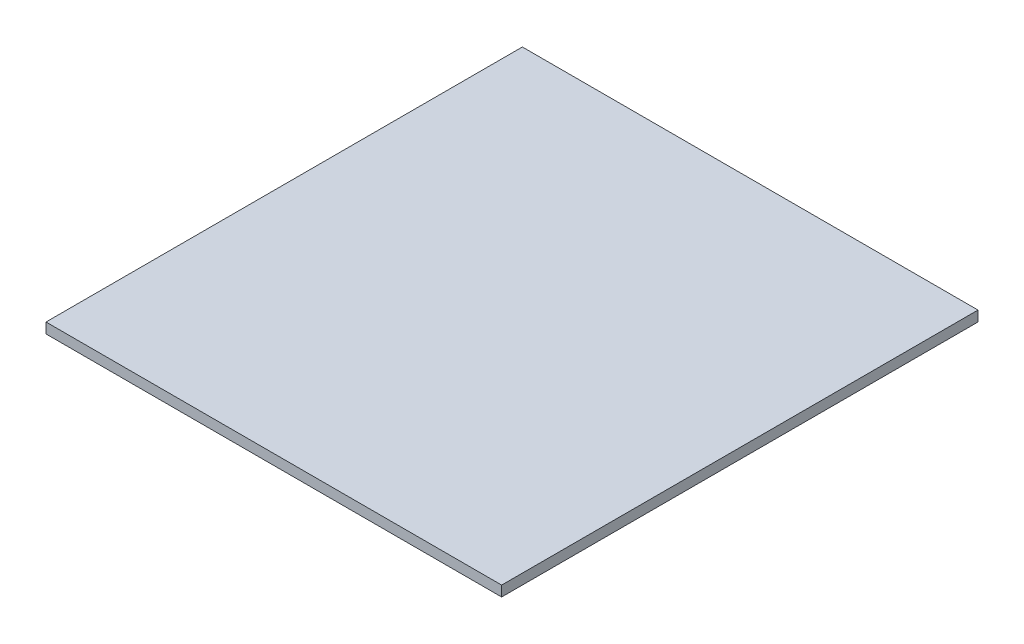
ISO-10303-21;
HEADER;
FILE_DESCRIPTION(('STEP AP214'),'2;1');
FILE_NAME('part.step','',(''),(''),'','','');
FILE_SCHEMA(('AUTOMOTIVE_DESIGN { 1 0 10303 214 1 1 1 1 }'));
ENDSEC;
DATA;
#1=APPLICATION_CONTEXT('core data for automotive mechanical design processes');
#2=APPLICATION_PROTOCOL_DEFINITION('international standard','automotive_design',2000,#1);
#3=PRODUCT_CONTEXT('',#1,'mechanical');
#4=PRODUCT('Part','Part','',(#3));
#5=PRODUCT_RELATED_PRODUCT_CATEGORY('part','',(#4));
#6=PRODUCT_DEFINITION_FORMATION('','',#4);
#7=PRODUCT_DEFINITION_CONTEXT('part definition',#1,'design');
#8=PRODUCT_DEFINITION('design','',#6,#7);
#9=PRODUCT_DEFINITION_SHAPE('','',#8);
#10=(LENGTH_UNIT() NAMED_UNIT(*) SI_UNIT(.MILLI.,.METRE.));
#11=(NAMED_UNIT(*) PLANE_ANGLE_UNIT() SI_UNIT($,.RADIAN.));
#12=(NAMED_UNIT(*) SI_UNIT($,.STERADIAN.) SOLID_ANGLE_UNIT());
#13=UNCERTAINTY_MEASURE_WITH_UNIT(LENGTH_MEASURE(1.E-05),#10,'distance_accuracy_value','');
#14=(GEOMETRIC_REPRESENTATION_CONTEXT(3) GLOBAL_UNCERTAINTY_ASSIGNED_CONTEXT((#13)) GLOBAL_UNIT_ASSIGNED_CONTEXT((#10,
#11,#12)) REPRESENTATION_CONTEXT('',''));
#15=CARTESIAN_POINT('',(0.,0.,0.));
#16=DIRECTION('',(0.,0.,1.));
#17=DIRECTION('',(1.,0.,0.));
#18=AXIS2_PLACEMENT_3D('',#15,#16,#17);
#19=CARTESIAN_POINT('',(0.,6.35,0.));
#20=DIRECTION('',(1.,0.,0.));
#21=DIRECTION('',(0.,0.,-1.));
#22=AXIS2_PLACEMENT_3D('',#19,#20,#21);
#23=PLANE('',#22);
#24=DIRECTION('',(0.,0.,1.));
#25=VECTOR('',#24,1.);
#26=CARTESIAN_POINT('',(0.,0.,0.));
#27=LINE('',#26,#25);
#28=CARTESIAN_POINT('',(0.,0.,-292.1));
#29=VERTEX_POINT('',#28);
#30=CARTESIAN_POINT('',(0.,0.,0.));
#31=VERTEX_POINT('',#30);
#32=EDGE_CURVE('E107',#29,#31,#27,.T.);
#33=ORIENTED_EDGE('',*,*,#32,.T.);
#34=DIRECTION('',(0.,-1.,0.));
#35=VECTOR('',#34,1.);
#36=CARTESIAN_POINT('',(0.,6.35,0.));
#37=LINE('',#36,#35);
#38=CARTESIAN_POINT('',(0.,6.35,0.));
#39=VERTEX_POINT('',#38);
#40=EDGE_CURVE('E11',#39,#31,#37,.T.);
#41=ORIENTED_EDGE('',*,*,#40,.F.);
#42=DIRECTION('',(0.,0.,1.));
#43=VECTOR('',#42,1.);
#44=CARTESIAN_POINT('',(0.,6.35,0.));
#45=LINE('',#44,#43);
#46=CARTESIAN_POINT('',(0.,6.35,-292.1));
#47=VERTEX_POINT('',#46);
#48=EDGE_CURVE('E91',#47,#39,#45,.T.);
#49=ORIENTED_EDGE('',*,*,#48,.F.);
#50=DIRECTION('',(0.,-1.,0.));
#51=VECTOR('',#50,1.);
#52=CARTESIAN_POINT('',(0.,6.35,-292.1));
#53=LINE('',#52,#51);
#54=EDGE_CURVE('E103',#47,#29,#53,.T.);
#55=ORIENTED_EDGE('',*,*,#54,.T.);
#56=EDGE_LOOP('',(#33,#41,#49,#55));
#57=FACE_BOUND('',#56,.T.);
#58=ADVANCED_FACE('F39',(#57),#23,.F.);
#59=CARTESIAN_POINT('',(0.,6.35,0.));
#60=DIRECTION('',(0.,0.,-1.));
#61=DIRECTION('',(-1.,0.,0.));
#62=AXIS2_PLACEMENT_3D('',#59,#60,#61);
#63=PLANE('',#62);
#64=DIRECTION('',(1.,0.,0.));
#65=VECTOR('',#64,1.);
#66=CARTESIAN_POINT('',(0.,0.,0.));
#67=LINE('',#66,#65);
#68=CARTESIAN_POINT('',(279.4,0.,0.));
#69=VERTEX_POINT('',#68);
#70=EDGE_CURVE('E96',#31,#69,#67,.T.);
#71=ORIENTED_EDGE('',*,*,#70,.T.);
#72=DIRECTION('',(0.,-1.,0.));
#73=VECTOR('',#72,1.);
#74=CARTESIAN_POINT('',(279.4,6.35,0.));
#75=LINE('',#74,#73);
#76=CARTESIAN_POINT('',(279.4,6.35,0.));
#77=VERTEX_POINT('',#76);
#78=EDGE_CURVE('E48',#77,#69,#75,.T.);
#79=ORIENTED_EDGE('',*,*,#78,.F.);
#80=DIRECTION('',(1.,0.,0.));
#81=VECTOR('',#80,1.);
#82=CARTESIAN_POINT('',(0.,6.35,0.));
#83=LINE('',#82,#81);
#84=EDGE_CURVE('E86',#39,#77,#83,.T.);
#85=ORIENTED_EDGE('',*,*,#84,.F.);
#86=ORIENTED_EDGE('',*,*,#40,.T.);
#87=EDGE_LOOP('',(#71,#79,#85,#86));
#88=FACE_BOUND('',#87,.T.);
#89=ADVANCED_FACE('F95',(#88),#63,.F.);
#90=CARTESIAN_POINT('',(279.4,6.35,0.));
#91=DIRECTION('',(-1.,0.,0.));
#92=DIRECTION('',(0.,0.,1.));
#93=AXIS2_PLACEMENT_3D('',#90,#91,#92);
#94=PLANE('',#93);
#95=DIRECTION('',(0.,0.,-1.));
#96=VECTOR('',#95,1.);
#97=CARTESIAN_POINT('',(279.4,0.,0.));
#98=LINE('',#97,#96);
#99=CARTESIAN_POINT('',(279.4,0.,-292.1));
#100=VERTEX_POINT('',#99);
#101=EDGE_CURVE('E73',#69,#100,#98,.T.);
#102=ORIENTED_EDGE('',*,*,#101,.T.);
#103=DIRECTION('',(0.,-1.,0.));
#104=VECTOR('',#103,1.);
#105=CARTESIAN_POINT('',(279.4,6.35,-292.1));
#106=LINE('',#105,#104);
#107=CARTESIAN_POINT('',(279.4,6.35,-292.1));
#108=VERTEX_POINT('',#107);
#109=EDGE_CURVE('E98',#108,#100,#106,.T.);
#110=ORIENTED_EDGE('',*,*,#109,.F.);
#111=DIRECTION('',(0.,0.,-1.));
#112=VECTOR('',#111,1.);
#113=CARTESIAN_POINT('',(279.4,6.35,0.));
#114=LINE('',#113,#112);
#115=EDGE_CURVE('E89',#77,#108,#114,.T.);
#116=ORIENTED_EDGE('',*,*,#115,.F.);
#117=ORIENTED_EDGE('',*,*,#78,.T.);
#118=EDGE_LOOP('',(#102,#110,#116,#117));
#119=FACE_BOUND('',#118,.T.);
#120=ADVANCED_FACE('F99',(#119),#94,.F.);
#121=CARTESIAN_POINT('',(0.,6.35,-292.1));
#122=DIRECTION('',(0.,0.,1.));
#123=DIRECTION('',(1.,0.,0.));
#124=AXIS2_PLACEMENT_3D('',#121,#122,#123);
#125=PLANE('',#124);
#126=DIRECTION('',(-1.,0.,0.));
#127=VECTOR('',#126,1.);
#128=CARTESIAN_POINT('',(0.,0.,-292.1));
#129=LINE('',#128,#127);
#130=EDGE_CURVE('E79',#100,#29,#129,.T.);
#131=ORIENTED_EDGE('',*,*,#130,.T.);
#132=ORIENTED_EDGE('',*,*,#54,.F.);
#133=DIRECTION('',(-1.,0.,0.));
#134=VECTOR('',#133,1.);
#135=CARTESIAN_POINT('',(0.,6.35,-292.1));
#136=LINE('',#135,#134);
#137=EDGE_CURVE('E56',#108,#47,#136,.T.);
#138=ORIENTED_EDGE('',*,*,#137,.F.);
#139=ORIENTED_EDGE('',*,*,#109,.T.);
#140=EDGE_LOOP('',(#131,#132,#138,#139));
#141=FACE_BOUND('',#140,.T.);
#142=ADVANCED_FACE('F120',(#141),#125,.F.);
#143=CARTESIAN_POINT('',(0.,6.35,0.));
#144=DIRECTION('',(0.,-1.,0.));
#145=DIRECTION('',(0.,0.,-1.));
#146=AXIS2_PLACEMENT_3D('',#143,#144,#145);
#147=PLANE('',#146);
#148=ORIENTED_EDGE('',*,*,#48,.T.);
#149=ORIENTED_EDGE('',*,*,#84,.T.);
#150=ORIENTED_EDGE('',*,*,#115,.T.);
#151=ORIENTED_EDGE('',*,*,#137,.T.);
#152=EDGE_LOOP('',(#148,#149,#150,#151));
#153=FACE_BOUND('',#152,.T.);
#154=ADVANCED_FACE('F87',(#153),#147,.F.);
#155=CARTESIAN_POINT('',(0.,0.,0.));
#156=DIRECTION('',(0.,-1.,0.));
#157=DIRECTION('',(0.,0.,-1.));
#158=AXIS2_PLACEMENT_3D('',#155,#156,#157);
#159=PLANE('',#158);
#160=ORIENTED_EDGE('',*,*,#32,.F.);
#161=ORIENTED_EDGE('',*,*,#130,.F.);
#162=ORIENTED_EDGE('',*,*,#101,.F.);
#163=ORIENTED_EDGE('',*,*,#70,.F.);
#164=EDGE_LOOP('',(#160,#161,#162,#163));
#165=FACE_BOUND('',#164,.T.);
#166=ADVANCED_FACE('F123',(#165),#159,.T.);
#167=CLOSED_SHELL('',(#58,#89,#120,#142,#154,#166));
#168=MANIFOLD_SOLID_BREP('B2',#167);
#169=ADVANCED_BREP_SHAPE_REPRESENTATION('',(#18,#168),#14);
#170=SHAPE_DEFINITION_REPRESENTATION(#9,#169);
ENDSEC;
END-ISO-10303-21;
